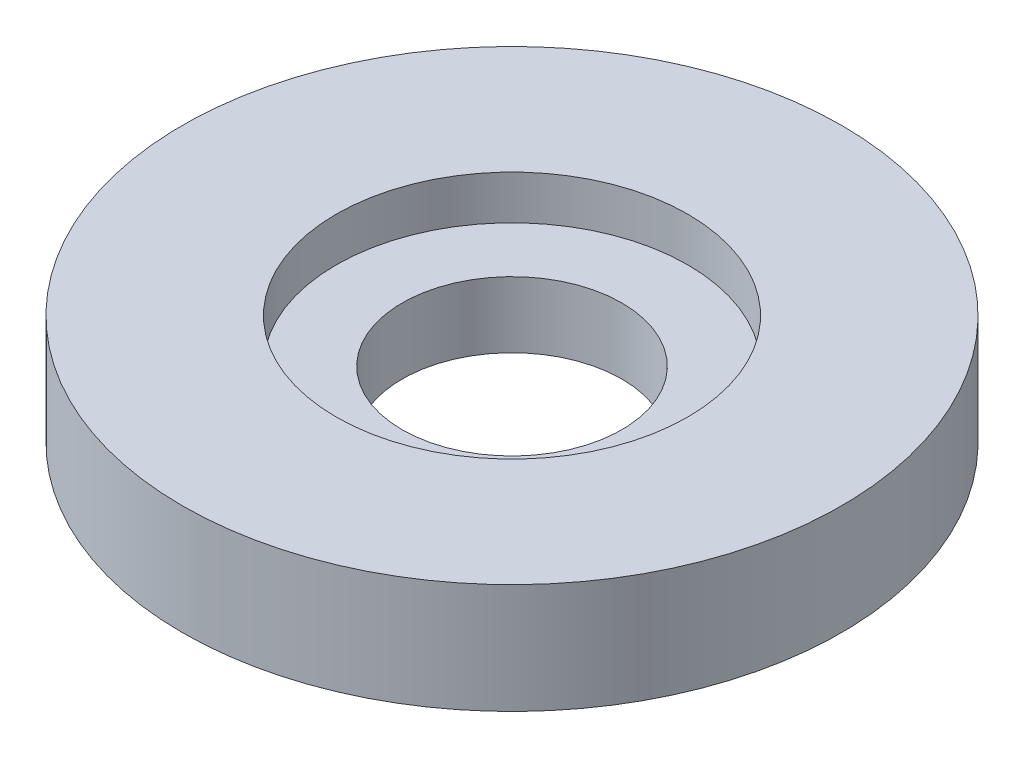
ISO-10303-21;
HEADER;
FILE_DESCRIPTION(('STEP AP214'),'2;1');
FILE_NAME('part.step','',(''),(''),'','','');
FILE_SCHEMA(('AUTOMOTIVE_DESIGN { 1 0 10303 214 1 1 1 1 }'));
ENDSEC;
DATA;
#1=APPLICATION_CONTEXT('core data for automotive mechanical design processes');
#2=APPLICATION_PROTOCOL_DEFINITION('international standard','automotive_design',2000,#1);
#3=PRODUCT_CONTEXT('',#1,'mechanical');
#4=PRODUCT('Part','Part','',(#3));
#5=PRODUCT_RELATED_PRODUCT_CATEGORY('part','',(#4));
#6=PRODUCT_DEFINITION_FORMATION('','',#4);
#7=PRODUCT_DEFINITION_CONTEXT('part definition',#1,'design');
#8=PRODUCT_DEFINITION('design','',#6,#7);
#9=PRODUCT_DEFINITION_SHAPE('','',#8);
#10=(LENGTH_UNIT() NAMED_UNIT(*) SI_UNIT(.MILLI.,.METRE.));
#11=(NAMED_UNIT(*) PLANE_ANGLE_UNIT() SI_UNIT($,.RADIAN.));
#12=(NAMED_UNIT(*) SI_UNIT($,.STERADIAN.) SOLID_ANGLE_UNIT());
#13=UNCERTAINTY_MEASURE_WITH_UNIT(LENGTH_MEASURE(1.E-05),#10,'distance_accuracy_value','');
#14=(GEOMETRIC_REPRESENTATION_CONTEXT(3) GLOBAL_UNCERTAINTY_ASSIGNED_CONTEXT((#13)) GLOBAL_UNIT_ASSIGNED_CONTEXT((#10,
#11,#12)) REPRESENTATION_CONTEXT('',''));
#15=CARTESIAN_POINT('',(0.,0.,0.));
#16=DIRECTION('',(0.,0.,1.));
#17=DIRECTION('',(1.,0.,0.));
#18=AXIS2_PLACEMENT_3D('',#15,#16,#17);
#19=CARTESIAN_POINT('',(0.,5.,0.));
#20=DIRECTION('',(0.,-1.,0.));
#21=DIRECTION('',(0.,0.,-1.));
#22=AXIS2_PLACEMENT_3D('',#19,#20,#21);
#23=CYLINDRICAL_SURFACE('',#22,5.);
#24=CARTESIAN_POINT('',(0.,0.,0.));
#25=DIRECTION('',(0.,1.,0.));
#26=DIRECTION('',(0.,0.,1.));
#27=AXIS2_PLACEMENT_3D('',#24,#25,#26);
#28=CIRCLE('',#27,5.);
#29=CARTESIAN_POINT('',(0.,0.,5.));
#30=VERTEX_POINT('',#29);
#31=EDGE_CURVE('E47',#30,#30,#28,.T.);
#32=ORIENTED_EDGE('',*,*,#31,.F.);
#33=EDGE_LOOP('',(#32));
#34=FACE_BOUND('',#33,.T.);
#35=CARTESIAN_POINT('',(0.,3.,0.));
#36=DIRECTION('',(0.,1.,0.));
#37=DIRECTION('',(0.,0.,1.));
#38=AXIS2_PLACEMENT_3D('',#35,#36,#37);
#39=CIRCLE('',#38,5.);
#40=CARTESIAN_POINT('',(0.,3.,5.));
#41=VERTEX_POINT('',#40);
#42=EDGE_CURVE('E38',#41,#41,#39,.T.);
#43=ORIENTED_EDGE('',*,*,#42,.T.);
#44=EDGE_LOOP('',(#43));
#45=FACE_BOUND('',#44,.T.);
#46=ADVANCED_FACE('F34',(#34,#45),#23,.F.);
#47=CARTESIAN_POINT('',(0.,5.,0.));
#48=DIRECTION('',(0.,1.,0.));
#49=DIRECTION('',(0.,0.,1.));
#50=AXIS2_PLACEMENT_3D('',#47,#48,#49);
#51=PLANE('',#50);
#52=CARTESIAN_POINT('',(0.,5.,0.));
#53=DIRECTION('',(0.,1.,0.));
#54=DIRECTION('',(0.,0.,1.));
#55=AXIS2_PLACEMENT_3D('',#52,#53,#54);
#56=CIRCLE('',#55,8.);
#57=CARTESIAN_POINT('',(0.,5.,8.));
#58=VERTEX_POINT('',#57);
#59=EDGE_CURVE('E51',#58,#58,#56,.T.);
#60=ORIENTED_EDGE('',*,*,#59,.F.);
#61=EDGE_LOOP('',(#60));
#62=FACE_BOUND('',#61,.T.);
#63=CARTESIAN_POINT('',(0.,5.,0.));
#64=DIRECTION('',(0.,1.,0.));
#65=DIRECTION('',(0.,0.,1.));
#66=AXIS2_PLACEMENT_3D('',#63,#64,#65);
#67=CIRCLE('',#66,15.);
#68=CARTESIAN_POINT('',(0.,5.,15.));
#69=VERTEX_POINT('',#68);
#70=EDGE_CURVE('E10',#69,#69,#67,.T.);
#71=ORIENTED_EDGE('',*,*,#70,.T.);
#72=EDGE_LOOP('',(#71));
#73=FACE_BOUND('',#72,.T.);
#74=ADVANCED_FACE('F72',(#62,#73),#51,.T.);
#75=CARTESIAN_POINT('',(0.,0.,0.));
#76=DIRECTION('',(0.,1.,0.));
#77=DIRECTION('',(0.,0.,1.));
#78=AXIS2_PLACEMENT_3D('',#75,#76,#77);
#79=PLANE('',#78);
#80=CARTESIAN_POINT('',(0.,0.,0.));
#81=DIRECTION('',(0.,1.,0.));
#82=DIRECTION('',(0.,0.,1.));
#83=AXIS2_PLACEMENT_3D('',#80,#81,#82);
#84=CIRCLE('',#83,15.);
#85=CARTESIAN_POINT('',(0.,0.,15.));
#86=VERTEX_POINT('',#85);
#87=EDGE_CURVE('E42',#86,#86,#84,.T.);
#88=ORIENTED_EDGE('',*,*,#87,.F.);
#89=EDGE_LOOP('',(#88));
#90=FACE_BOUND('',#89,.T.);
#91=ORIENTED_EDGE('',*,*,#31,.T.);
#92=EDGE_LOOP('',(#91));
#93=FACE_BOUND('',#92,.T.);
#94=ADVANCED_FACE('F78',(#90,#93),#79,.F.);
#95=CARTESIAN_POINT('',(0.,5.,0.));
#96=DIRECTION('',(0.,-1.,0.));
#97=DIRECTION('',(0.,0.,-1.));
#98=AXIS2_PLACEMENT_3D('',#95,#96,#97);
#99=CYLINDRICAL_SURFACE('',#98,15.);
#100=ORIENTED_EDGE('',*,*,#70,.F.);
#101=EDGE_LOOP('',(#100));
#102=FACE_BOUND('',#101,.T.);
#103=ORIENTED_EDGE('',*,*,#87,.T.);
#104=EDGE_LOOP('',(#103));
#105=FACE_BOUND('',#104,.T.);
#106=ADVANCED_FACE('F36',(#102,#105),#99,.T.);
#107=CARTESIAN_POINT('',(0.,3.,0.));
#108=DIRECTION('',(0.,1.,0.));
#109=DIRECTION('',(0.,0.,1.));
#110=AXIS2_PLACEMENT_3D('',#107,#108,#109);
#111=CYLINDRICAL_SURFACE('',#110,8.);
#112=CARTESIAN_POINT('',(0.,3.,0.));
#113=DIRECTION('',(0.,1.,0.));
#114=DIRECTION('',(0.,0.,1.));
#115=AXIS2_PLACEMENT_3D('',#112,#113,#114);
#116=CIRCLE('',#115,8.);
#117=CARTESIAN_POINT('',(0.,3.,8.));
#118=VERTEX_POINT('',#117);
#119=EDGE_CURVE('E54',#118,#118,#116,.T.);
#120=ORIENTED_EDGE('',*,*,#119,.F.);
#121=EDGE_LOOP('',(#120));
#122=FACE_BOUND('',#121,.T.);
#123=ORIENTED_EDGE('',*,*,#59,.T.);
#124=EDGE_LOOP('',(#123));
#125=FACE_BOUND('',#124,.T.);
#126=ADVANCED_FACE('F64',(#122,#125),#111,.F.);
#127=CARTESIAN_POINT('',(0.,3.,0.));
#128=DIRECTION('',(0.,1.,0.));
#129=DIRECTION('',(0.,0.,1.));
#130=AXIS2_PLACEMENT_3D('',#127,#128,#129);
#131=PLANE('',#130);
#132=ORIENTED_EDGE('',*,*,#42,.F.);
#133=EDGE_LOOP('',(#132));
#134=FACE_BOUND('',#133,.T.);
#135=ORIENTED_EDGE('',*,*,#119,.T.);
#136=EDGE_LOOP('',(#135));
#137=FACE_BOUND('',#136,.T.);
#138=ADVANCED_FACE('F62',(#134,#137),#131,.T.);
#139=CLOSED_SHELL('',(#46,#74,#94,#106,#126,#138));
#140=MANIFOLD_SOLID_BREP('B2',#139);
#141=ADVANCED_BREP_SHAPE_REPRESENTATION('',(#18,#140),#14);
#142=SHAPE_DEFINITION_REPRESENTATION(#9,#141);
ENDSEC;
END-ISO-10303-21;
